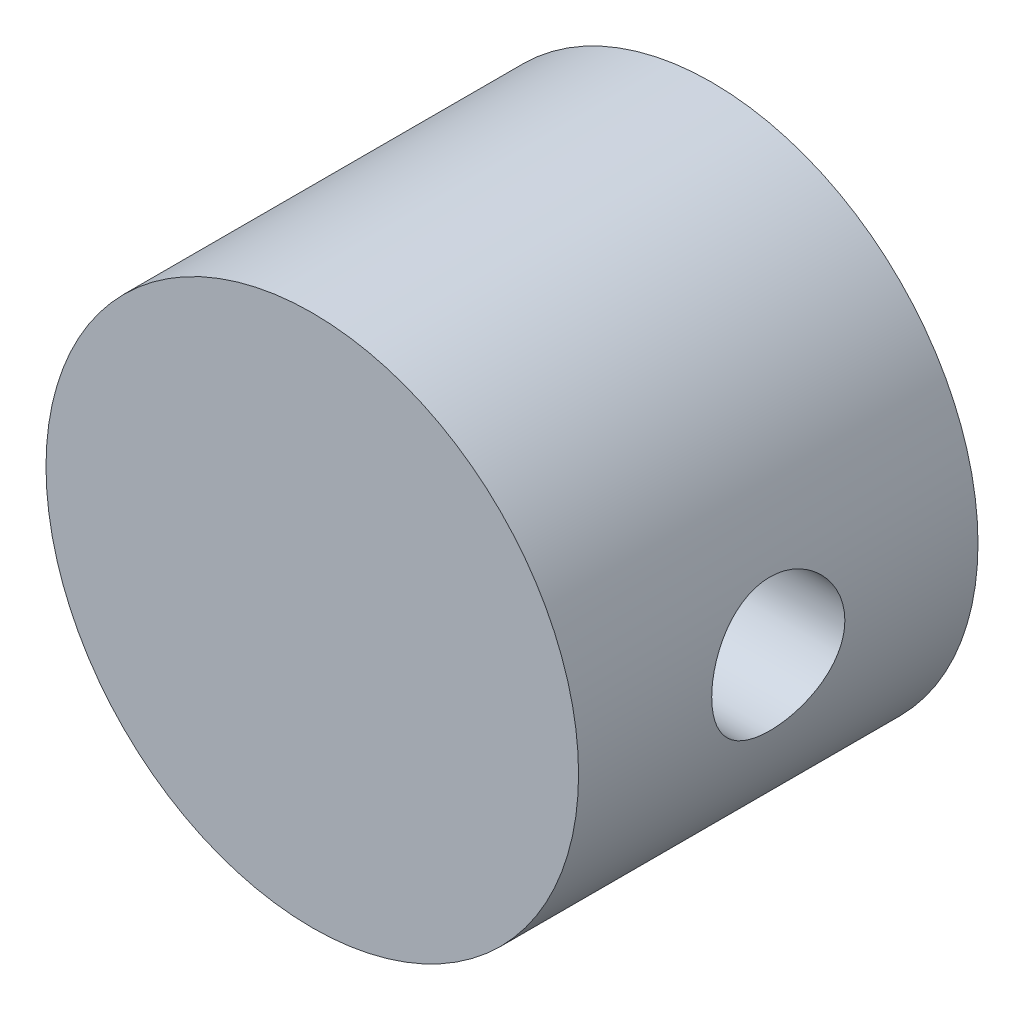
ISO-10303-21;
HEADER;
FILE_DESCRIPTION(('STEP AP214'),'2;1');
FILE_NAME('part.step','',(''),(''),'','','');
FILE_SCHEMA(('AUTOMOTIVE_DESIGN { 1 0 10303 214 1 1 1 1 }'));
ENDSEC;
DATA;
#1=APPLICATION_CONTEXT('core data for automotive mechanical design processes');
#2=APPLICATION_PROTOCOL_DEFINITION('international standard','automotive_design',2000,#1);
#3=PRODUCT_CONTEXT('',#1,'mechanical');
#4=PRODUCT('Part','Part','',(#3));
#5=PRODUCT_RELATED_PRODUCT_CATEGORY('part','',(#4));
#6=PRODUCT_DEFINITION_FORMATION('','',#4);
#7=PRODUCT_DEFINITION_CONTEXT('part definition',#1,'design');
#8=PRODUCT_DEFINITION('design','',#6,#7);
#9=PRODUCT_DEFINITION_SHAPE('','',#8);
#10=(LENGTH_UNIT() NAMED_UNIT(*) SI_UNIT(.MILLI.,.METRE.));
#11=(NAMED_UNIT(*) PLANE_ANGLE_UNIT() SI_UNIT($,.RADIAN.));
#12=(NAMED_UNIT(*) SI_UNIT($,.STERADIAN.) SOLID_ANGLE_UNIT());
#13=UNCERTAINTY_MEASURE_WITH_UNIT(LENGTH_MEASURE(1.E-05),#10,'distance_accuracy_value','');
#14=(GEOMETRIC_REPRESENTATION_CONTEXT(3) GLOBAL_UNCERTAINTY_ASSIGNED_CONTEXT((#13)) GLOBAL_UNIT_ASSIGNED_CONTEXT((#10,
#11,#12)) REPRESENTATION_CONTEXT('',''));
#15=CARTESIAN_POINT('',(0.,0.,0.));
#16=DIRECTION('',(0.,0.,1.));
#17=DIRECTION('',(1.,0.,0.));
#18=AXIS2_PLACEMENT_3D('',#15,#16,#17);
#19=CARTESIAN_POINT('',(0.,0.,12.));
#20=DIRECTION('',(0.,0.,1.));
#21=DIRECTION('',(1.,0.,0.));
#22=AXIS2_PLACEMENT_3D('',#19,#20,#21);
#23=PLANE('',#22);
#24=CARTESIAN_POINT('',(-14.6740168600354,4.15452096653423,12.));
#25=DIRECTION('',(0.,0.,1.));
#26=DIRECTION('',(1.,0.,0.));
#27=AXIS2_PLACEMENT_3D('',#24,#25,#26);
#28=CIRCLE('',#27,8.);
#29=CARTESIAN_POINT('',(-6.6740168600354,4.15452096653423,12.));
#30=VERTEX_POINT('',#29);
#31=EDGE_CURVE('E109',#30,#30,#28,.T.);
#32=ORIENTED_EDGE('',*,*,#31,.T.);
#33=EDGE_LOOP('',(#32));
#34=FACE_BOUND('',#33,.T.);
#35=ADVANCED_FACE('F91',(#34),#23,.T.);
#36=CARTESIAN_POINT('',(0.,0.,0.));
#37=DIRECTION('',(0.,0.,1.));
#38=DIRECTION('',(1.,0.,0.));
#39=AXIS2_PLACEMENT_3D('',#36,#37,#38);
#40=PLANE('',#39);
#41=CARTESIAN_POINT('',(-14.6740168600354,4.15452096653423,0.));
#42=DIRECTION('',(0.,0.,1.));
#43=DIRECTION('',(1.,0.,0.));
#44=AXIS2_PLACEMENT_3D('',#41,#42,#43);
#45=CIRCLE('',#44,8.);
#46=CARTESIAN_POINT('',(-6.6740168600354,4.15452096653423,0.));
#47=VERTEX_POINT('',#46);
#48=EDGE_CURVE('E104',#47,#47,#45,.T.);
#49=ORIENTED_EDGE('',*,*,#48,.F.);
#50=EDGE_LOOP('',(#49));
#51=FACE_BOUND('',#50,.T.);
#52=ADVANCED_FACE('F93',(#51),#40,.F.);
#53=CARTESIAN_POINT('',(-14.6740168600354,4.15452096653423,-0.999999999999999));
#54=DIRECTION('',(0.,0.,1.));
#55=DIRECTION('',(1.,0.,0.));
#56=AXIS2_PLACEMENT_3D('',#53,#54,#55);
#57=CYLINDRICAL_SURFACE('',#56,8.);
#58=CARTESIAN_POINT('',(-6.6740168600354,4.15452096653423,4.));
#59=CARTESIAN_POINT('',(-6.6740187284619,4.26502241809388,4.00000310098421));
#60=CARTESIAN_POINT('',(-6.67632915161105,4.37555851030858,4.00918873436505));
#61=CARTESIAN_POINT('',(-6.68532200897014,4.59346273156161,4.04563353507601));
#62=CARTESIAN_POINT('',(-6.69200692110238,4.70082902902855,4.07290294605047));
#63=CARTESIAN_POINT('',(-6.70900850894163,4.90921546277767,4.14458567128278));
#64=CARTESIAN_POINT('',(-6.71932082214128,5.01024305110757,4.18897839828703));
#65=CARTESIAN_POINT('',(-6.74247894260044,5.2034171424068,4.29357518672646));
#66=CARTESIAN_POINT('',(-6.75532483531331,5.29556334566592,4.35377978149196));
#67=CARTESIAN_POINT('',(-6.78245134547949,5.47025686960212,4.48960105287224));
#68=CARTESIAN_POINT('',(-6.79675409806038,5.55259521994897,4.56548209994541));
#69=CARTESIAN_POINT('',(-6.82503525846291,5.70351953613866,4.72993627321205));
#70=CARTESIAN_POINT('',(-6.83901362950383,5.77210394913315,4.81851083059592));
#71=CARTESIAN_POINT('',(-6.86528651739315,5.89455635693287,5.00746030231599));
#72=CARTESIAN_POINT('',(-6.87755293383792,5.94819058776775,5.10799097441164));
#73=CARTESIAN_POINT('',(-6.89869026246185,6.03771684460189,5.31699788221338));
#74=CARTESIAN_POINT('',(-6.90756171744315,6.07361170712109,5.42547284444269));
#75=CARTESIAN_POINT('',(-6.92067717075109,6.12592741560725,5.64499133093555));
#76=CARTESIAN_POINT('',(-6.92501031340858,6.14272399097697,5.75593986138399));
#77=CARTESIAN_POINT('',(-6.92882536057418,6.15753666662278,5.97915809199913));
#78=CARTESIAN_POINT('',(-6.92830805432968,6.15555582229171,6.09142757425618));
#79=CARTESIAN_POINT('',(-6.92256078647784,6.13316966605384,6.3112210769938));
#80=CARTESIAN_POINT('',(-6.91744535327148,6.11321208678841,6.41879416195377));
#81=CARTESIAN_POINT('',(-6.90326073108781,6.05615321573822,6.62901473454808));
#82=CARTESIAN_POINT('',(-6.89419126044555,6.01905070262676,6.73166187070523));
#83=CARTESIAN_POINT('',(-6.87301534129328,5.92837360378381,6.93031735500284));
#84=CARTESIAN_POINT('',(-6.86087916043785,5.87463652284479,7.02624822905276));
#85=CARTESIAN_POINT('',(-6.83495404875552,5.75232933455416,7.2078916130091));
#86=CARTESIAN_POINT('',(-6.82116482890703,5.68375663161268,7.29360233075634));
#87=CARTESIAN_POINT('',(-6.79300511950351,5.53140553277586,7.45493815425921));
#88=CARTESIAN_POINT('',(-6.77862926699538,5.44724931075538,7.53020598674847));
#89=CARTESIAN_POINT('',(-6.75127065231865,5.26733685653916,7.6656283232852));
#90=CARTESIAN_POINT('',(-6.73828793270996,5.17158027014482,7.72578236568476));
#91=CARTESIAN_POINT('',(-6.71511376544619,4.97067548477609,7.82940078163252));
#92=CARTESIAN_POINT('',(-6.70493205833237,4.86549615747906,7.87280712033924));
#93=CARTESIAN_POINT('',(-6.68857796681651,4.64902231072474,7.94122307427943));
#94=CARTESIAN_POINT('',(-6.68240481551166,4.53772896540154,7.96623620855752));
#95=CARTESIAN_POINT('',(-6.67487686975039,4.31524092705427,7.99661008741178));
#96=CARTESIAN_POINT('',(-6.67340281325835,4.20411659318518,8.0024573681004));
#97=CARTESIAN_POINT('',(-6.67509946250939,3.98247713346555,7.99566799725935));
#98=CARTESIAN_POINT('',(-6.67826975014411,3.87196195367477,7.98303300960116));
#99=CARTESIAN_POINT('',(-6.68882244500397,3.65636860816557,7.94003878881149));
#100=CARTESIAN_POINT('',(-6.69614173755791,3.55123414124256,7.90994498203068));
#101=CARTESIAN_POINT('',(-6.71416743824694,3.34751124326422,7.83319055462874));
#102=CARTESIAN_POINT('',(-6.72487418843683,3.24892347449072,7.78652826091577));
#103=CARTESIAN_POINT('',(-6.74877275435126,3.05915678729443,7.6770184948337));
#104=CARTESIAN_POINT('',(-6.76200529514297,2.96814037741979,7.61389851680432));
#105=CARTESIAN_POINT('',(-6.78942340420314,2.7978188150099,7.47361345493737));
#106=CARTESIAN_POINT('',(-6.80360913667933,2.71851568790355,7.39644594717746));
#107=CARTESIAN_POINT('',(-6.83176410055845,2.57186687577059,7.22799738554072));
#108=CARTESIAN_POINT('',(-6.84571947087165,2.50486247637152,7.13641639599677));
#109=CARTESIAN_POINT('',(-6.87144514833888,2.38717328785064,6.94302315404571));
#110=CARTESIAN_POINT('',(-6.88321555247505,2.33648777432365,6.84121135605366));
#111=CARTESIAN_POINT('',(-6.90310893023986,2.25325240572184,6.63079237011589));
#112=CARTESIAN_POINT('',(-6.91125345614332,2.22059510432881,6.52222982887465));
#113=CARTESIAN_POINT('',(-6.92299360549962,2.17406008659586,6.30092048281452));
#114=CARTESIAN_POINT('',(-6.92659022376958,2.16017826322935,6.18817459862334));
#115=CARTESIAN_POINT('',(-6.92875151064931,2.15180284608891,5.96517196819306));
#116=CARTESIAN_POINT('',(-6.92745775699188,2.15676376949407,5.85493675316702));
#117=CARTESIAN_POINT('',(-6.9203114065975,2.18468459545041,5.63692814844269));
#118=CARTESIAN_POINT('',(-6.91445890147731,2.20764413628521,5.52915470931513));
#119=CARTESIAN_POINT('',(-6.89893338426576,2.27061254061051,5.31972205457945));
#120=CARTESIAN_POINT('',(-6.88928332355127,2.31051909362706,5.21803025967972));
#121=CARTESIAN_POINT('',(-6.86724678370435,2.40616774839414,5.02271282304841));
#122=CARTESIAN_POINT('',(-6.85485992509176,2.46191204648865,4.92908830241745));
#123=CARTESIAN_POINT('',(-6.8283417365219,2.58936396835138,4.74992716133064));
#124=CARTESIAN_POINT('',(-6.81417332894531,2.66145008265123,4.66466523543472));
#125=CARTESIAN_POINT('',(-6.78590983008492,2.81880180494792,4.50727060693946));
#126=CARTESIAN_POINT('',(-6.77181475700793,2.90407053818604,4.43514102651604));
#127=CARTESIAN_POINT('',(-6.74498145139989,3.08723085093078,4.30478492191386));
#128=CARTESIAN_POINT('',(-6.73227241515716,3.18532307011238,4.24683384843789));
#129=CARTESIAN_POINT('',(-6.70995119370049,3.39016622052027,4.14833671607929));
#130=CARTESIAN_POINT('',(-6.70033679070498,3.49691088195191,4.10777818580195));
#131=CARTESIAN_POINT('',(-6.68670939916151,3.69530729554294,4.05123755956046));
#132=CARTESIAN_POINT('',(-6.68198239266619,3.78601407199014,4.03206500926209));
#133=CARTESIAN_POINT('',(-6.67563545694275,3.96931287115252,4.00644540850408));
#134=CARTESIAN_POINT('',(-6.67401529402347,4.06190475154408,3.99999740092627));
#135=CARTESIAN_POINT('',(-6.6740168600354,4.15452096653423,4.));
#136=B_SPLINE_CURVE_WITH_KNOTS('',3,(#58,#59,#60,#61,#62,#63,#64,#65,#66,#67,#68,#69,#70,#71,
#72,#73,#74,#75,#76,#77,#78,#79,#80,#81,#82,#83,#84,#85,#86,#87,#88,#89,#90,#91,#92,#93,#94,#95,
#96,#97,#98,#99,#100,#101,#102,#103,#104,#105,#106,#107,#108,#109,#110,#111,#112,#113,#114,#115,
#116,#117,#118,#119,#120,#121,#122,#123,#124,#125,#126,#127,#128,#129,#130,#131,#132,#133,#134,
#135),.UNSPECIFIED.,.T.,.F.,(4,2,2,2,2,2,2,2,2,2,2,2,2,2,2,2,2,2,2,2,2,2,2,2,2,2,2,2,2,2,2,2,2,
2,2,2,2,2,4),(0.,0.33116494996252,0.662517650351866,0.993473203048139,1.32443992022577,
1.66152580582852,1.99864972773416,2.34078196727743,2.68285948225825,3.01808393468093,
3.3532538415469,3.68029996013785,4.00736937959146,4.337740371696,4.66816921119311,
5.00802001296454,5.34788119415424,5.6889097201658,6.02987298255951,6.36211078603463,
6.69431868154751,7.02160366023144,7.34892169767482,7.68204783424897,8.01523150681786,
8.35659345610395,8.69794025003772,9.03723006156476,9.37644564340971,9.70591707202578,
10.0353818794581,10.3628853408369,10.6904342418696,11.0265276855097,11.3627009303165,
11.7049624733721,12.0469781843289,12.3245632392729,12.6021274139515),.UNSPECIFIED.);
#137=CARTESIAN_POINT('',(-6.6740168600354,4.15452096653423,4.));
#138=VERTEX_POINT('',#137);
#139=EDGE_CURVE('E11',#138,#138,#136,.T.);
#140=ORIENTED_EDGE('',*,*,#139,.F.);
#141=EDGE_LOOP('',(#140));
#142=FACE_BOUND('',#141,.T.);
#143=ORIENTED_EDGE('',*,*,#31,.F.);
#144=EDGE_LOOP('',(#143));
#145=FACE_BOUND('',#144,.T.);
#146=ORIENTED_EDGE('',*,*,#48,.T.);
#147=EDGE_LOOP('',(#146));
#148=FACE_BOUND('',#147,.T.);
#149=ADVANCED_FACE('F125',(#142,#145,#148),#57,.T.);
#150=CARTESIAN_POINT('',(-16.6740168600354,4.15452096653423,6.));
#151=DIRECTION('',(1.,0.,0.));
#152=DIRECTION('',(0.,1.,0.));
#153=AXIS2_PLACEMENT_3D('',#150,#151,#152);
#154=CYLINDRICAL_SURFACE('',#153,2.);
#155=ORIENTED_EDGE('',*,*,#139,.T.);
#156=EDGE_LOOP('',(#155));
#157=FACE_BOUND('',#156,.T.);
#158=CARTESIAN_POINT('',(-16.6740168600354,4.15452096653423,6.));
#159=DIRECTION('',(1.,0.,0.));
#160=DIRECTION('',(0.,1.,0.));
#161=AXIS2_PLACEMENT_3D('',#158,#159,#160);
#162=CIRCLE('',#161,2.);
#163=CARTESIAN_POINT('',(-16.6740168600354,6.15452096653423,6.));
#164=VERTEX_POINT('',#163);
#165=EDGE_CURVE('E114',#164,#164,#162,.T.);
#166=ORIENTED_EDGE('',*,*,#165,.F.);
#167=EDGE_LOOP('',(#166));
#168=FACE_BOUND('',#167,.T.);
#169=ADVANCED_FACE('F123',(#157,#168),#154,.F.);
#170=CARTESIAN_POINT('',(-16.6740168600354,4.15452096653423,6.));
#171=DIRECTION('',(1.,0.,0.));
#172=DIRECTION('',(0.,1.,0.));
#173=AXIS2_PLACEMENT_3D('',#170,#171,#172);
#174=PLANE('',#173);
#175=ORIENTED_EDGE('',*,*,#165,.T.);
#176=EDGE_LOOP('',(#175));
#177=FACE_BOUND('',#176,.T.);
#178=ADVANCED_FACE('F121',(#177),#174,.T.);
#179=CLOSED_SHELL('',(#35,#52,#149,#169,#178));
#180=MANIFOLD_SOLID_BREP('B2',#179);
#181=ADVANCED_BREP_SHAPE_REPRESENTATION('',(#18,#180),#14);
#182=SHAPE_DEFINITION_REPRESENTATION(#9,#181);
ENDSEC;
END-ISO-10303-21;
